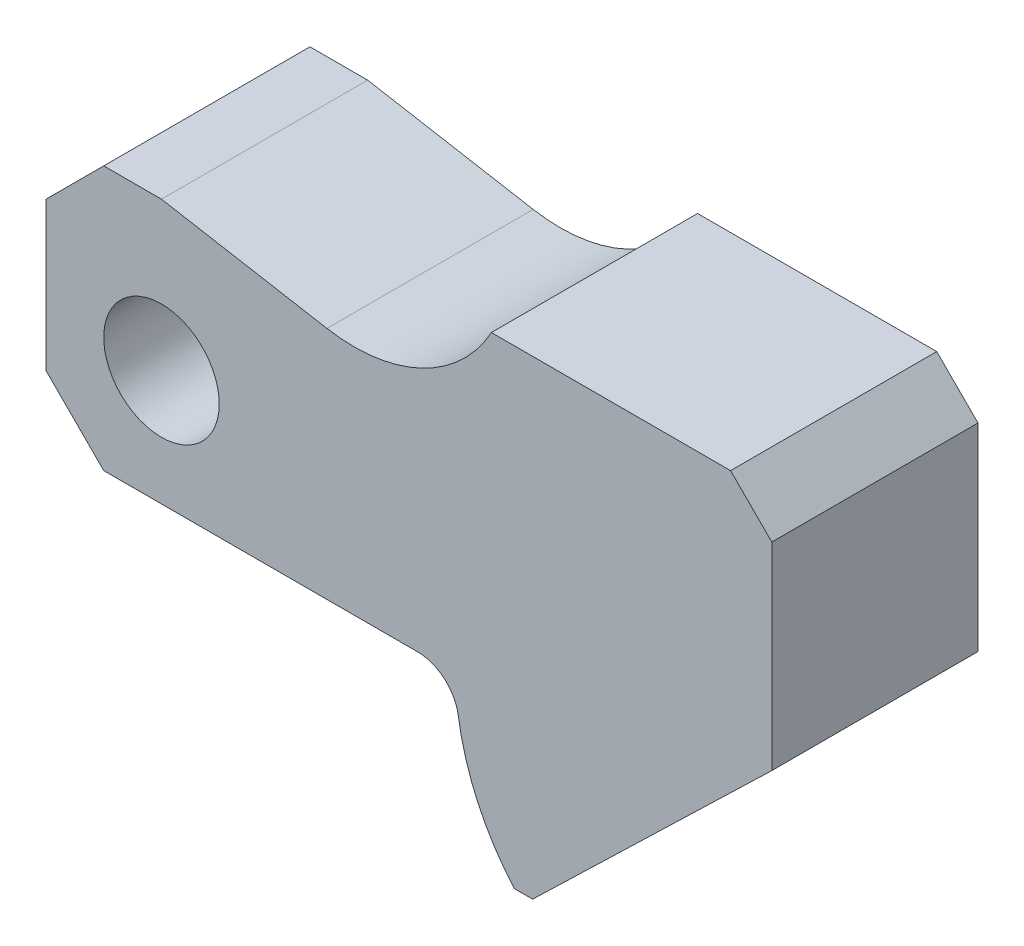
ISO-10303-21;
HEADER;
FILE_DESCRIPTION(('STEP AP214'),'2;1');
FILE_NAME('part.step','',(''),(''),'','','');
FILE_SCHEMA(('AUTOMOTIVE_DESIGN { 1 0 10303 214 1 1 1 1 }'));
ENDSEC;
DATA;
#1=APPLICATION_CONTEXT('core data for automotive mechanical design processes');
#2=APPLICATION_PROTOCOL_DEFINITION('international standard','automotive_design',2000,#1);
#3=PRODUCT_CONTEXT('',#1,'mechanical');
#4=PRODUCT('Part','Part','',(#3));
#5=PRODUCT_RELATED_PRODUCT_CATEGORY('part','',(#4));
#6=PRODUCT_DEFINITION_FORMATION('','',#4);
#7=PRODUCT_DEFINITION_CONTEXT('part definition',#1,'design');
#8=PRODUCT_DEFINITION('design','',#6,#7);
#9=PRODUCT_DEFINITION_SHAPE('','',#8);
#10=(LENGTH_UNIT() NAMED_UNIT(*) SI_UNIT(.MILLI.,.METRE.));
#11=(NAMED_UNIT(*) PLANE_ANGLE_UNIT() SI_UNIT($,.RADIAN.));
#12=(NAMED_UNIT(*) SI_UNIT($,.STERADIAN.) SOLID_ANGLE_UNIT());
#13=UNCERTAINTY_MEASURE_WITH_UNIT(LENGTH_MEASURE(1.E-05),#10,'distance_accuracy_value','');
#14=(GEOMETRIC_REPRESENTATION_CONTEXT(3) GLOBAL_UNCERTAINTY_ASSIGNED_CONTEXT((#13)) GLOBAL_UNIT_ASSIGNED_CONTEXT((#10,
#11,#12)) REPRESENTATION_CONTEXT('',''));
#15=CARTESIAN_POINT('',(0.,0.,0.));
#16=DIRECTION('',(0.,0.,1.));
#17=DIRECTION('',(1.,0.,0.));
#18=AXIS2_PLACEMENT_3D('',#15,#16,#17);
#19=CARTESIAN_POINT('',(0.,-10.,50.));
#20=DIRECTION('',(0.,0.,1.));
#21=DIRECTION('',(1.,0.,0.));
#22=AXIS2_PLACEMENT_3D('',#19,#20,#21);
#23=PLANE('',#22);
#24=CARTESIAN_POINT('',(0.,-10.,50.));
#25=DIRECTION('',(0.,0.,-1.));
#26=DIRECTION('',(1.,0.,0.));
#27=AXIS2_PLACEMENT_3D('',#24,#25,#26);
#28=CIRCLE('',#27,10.);
#29=CARTESIAN_POINT('',(0.,0.,50.));
#30=VERTEX_POINT('',#29);
#31=CARTESIAN_POINT('',(9.89127748282368,-8.52941176470592,50.));
#32=VERTEX_POINT('',#31);
#33=EDGE_CURVE('E221',#30,#32,#28,.T.);
#34=ORIENTED_EDGE('',*,*,#33,.T.);
#35=CARTESIAN_POINT('',(67.260686883201,0.,50.));
#36=DIRECTION('',(0.,0.,1.));
#37=DIRECTION('',(-1.,0.,0.));
#38=AXIS2_PLACEMENT_3D('',#35,#36,#37);
#39=CIRCLE('',#38,58.);
#40=CARTESIAN_POINT('',(23.4428822827877,-38.,50.));
#41=VERTEX_POINT('',#40);
#42=EDGE_CURVE('E120',#32,#41,#39,.T.);
#43=ORIENTED_EDGE('',*,*,#42,.T.);
#44=DIRECTION('',(1.,0.,0.));
#45=VECTOR('',#44,1.);
#46=CARTESIAN_POINT('',(27.9035440260581,-38.,50.));
#47=LINE('',#46,#45);
#48=CARTESIAN_POINT('',(27.9035440260581,-38.,50.));
#49=VERTEX_POINT('',#48);
#50=EDGE_CURVE('E267',#41,#49,#47,.T.);
#51=ORIENTED_EDGE('',*,*,#50,.T.);
#52=DIRECTION('',(0.719401460617409,0.694594513699567,0.));
#53=VECTOR('',#52,1.);
#54=CARTESIAN_POINT('',(85.9035440260581,18.,50.));
#55=LINE('',#54,#53);
#56=CARTESIAN_POINT('',(85.9035440260581,18.,50.));
#57=VERTEX_POINT('',#56);
#58=EDGE_CURVE('E287',#49,#57,#55,.T.);
#59=ORIENTED_EDGE('',*,*,#58,.T.);
#60=DIRECTION('',(0.,1.,0.));
#61=VECTOR('',#60,1.);
#62=CARTESIAN_POINT('',(85.9035440260581,66.,50.));
#63=LINE('',#62,#61);
#64=CARTESIAN_POINT('',(85.9035440260581,66.,50.));
#65=VERTEX_POINT('',#64);
#66=EDGE_CURVE('E283',#57,#65,#63,.T.);
#67=ORIENTED_EDGE('',*,*,#66,.T.);
#68=DIRECTION('',(-0.707106781186547,0.707106781186547,0.));
#69=VECTOR('',#68,1.);
#70=CARTESIAN_POINT('',(75.9035440260581,76.,50.));
#71=LINE('',#70,#69);
#72=CARTESIAN_POINT('',(75.9035440260581,76.,50.));
#73=VERTEX_POINT('',#72);
#74=EDGE_CURVE('E286',#65,#73,#71,.T.);
#75=ORIENTED_EDGE('',*,*,#74,.T.);
#76=DIRECTION('',(-1.,0.,0.));
#77=VECTOR('',#76,1.);
#78=CARTESIAN_POINT('',(17.9035440260581,76.,50.));
#79=LINE('',#78,#77);
#80=CARTESIAN_POINT('',(17.9035440260581,76.,50.));
#81=VERTEX_POINT('',#80);
#82=EDGE_CURVE('E292',#73,#81,#79,.T.);
#83=ORIENTED_EDGE('',*,*,#82,.T.);
#84=CARTESIAN_POINT('',(-15.3735066320414,94.3476946644064,50.));
#85=DIRECTION('',(0.,0.,-1.));
#86=DIRECTION('',(-1.,0.,0.));
#87=AXIS2_PLACEMENT_3D('',#84,#85,#86);
#88=CIRCLE('',#87,38.);
#89=CARTESIAN_POINT('',(-21.9721373833847,56.9250000499425,50.));
#90=VERTEX_POINT('',#89);
#91=EDGE_CURVE('E299',#81,#90,#88,.T.);
#92=ORIENTED_EDGE('',*,*,#91,.T.);
#93=DIRECTION('',(-0.984807753012208,0.173648177666931,0.));
#94=VECTOR('',#93,1.);
#95=CARTESIAN_POINT('',(-62.0964559739419,64.,50.));
#96=LINE('',#95,#94);
#97=CARTESIAN_POINT('',(-62.0964559739419,64.,50.));
#98=VERTEX_POINT('',#97);
#99=EDGE_CURVE('E302',#90,#98,#96,.T.);
#100=ORIENTED_EDGE('',*,*,#99,.T.);
#101=DIRECTION('',(-1.,0.,0.));
#102=VECTOR('',#101,1.);
#103=CARTESIAN_POINT('',(-76.0964559739419,64.,50.));
#104=LINE('',#103,#102);
#105=CARTESIAN_POINT('',(-76.0964559739419,64.,50.));
#106=VERTEX_POINT('',#105);
#107=EDGE_CURVE('E305',#98,#106,#104,.T.);
#108=ORIENTED_EDGE('',*,*,#107,.T.);
#109=DIRECTION('',(-0.707106781186549,-0.707106781186546,0.));
#110=VECTOR('',#109,1.);
#111=CARTESIAN_POINT('',(-90.0964559739419,50.,50.));
#112=LINE('',#111,#110);
#113=CARTESIAN_POINT('',(-90.0964559739419,50.,50.));
#114=VERTEX_POINT('',#113);
#115=EDGE_CURVE('E157',#106,#114,#112,.T.);
#116=ORIENTED_EDGE('',*,*,#115,.T.);
#117=DIRECTION('',(0.,-1.,0.));
#118=VECTOR('',#117,1.);
#119=CARTESIAN_POINT('',(-90.0964559739419,14.,50.));
#120=LINE('',#119,#118);
#121=CARTESIAN_POINT('',(-90.0964559739419,14.,50.));
#122=VERTEX_POINT('',#121);
#123=EDGE_CURVE('E151',#114,#122,#120,.T.);
#124=ORIENTED_EDGE('',*,*,#123,.T.);
#125=DIRECTION('',(0.707106781186549,-0.707106781186546,0.));
#126=VECTOR('',#125,1.);
#127=CARTESIAN_POINT('',(-76.0964559739419,0.,50.));
#128=LINE('',#127,#126);
#129=CARTESIAN_POINT('',(-76.0964559739419,0.,50.));
#130=VERTEX_POINT('',#129);
#131=EDGE_CURVE('E155',#122,#130,#128,.T.);
#132=ORIENTED_EDGE('',*,*,#131,.T.);
#133=DIRECTION('',(1.,0.,0.));
#134=VECTOR('',#133,1.);
#135=CARTESIAN_POINT('',(0.,0.,50.));
#136=LINE('',#135,#134);
#137=EDGE_CURVE('E59',#130,#30,#136,.T.);
#138=ORIENTED_EDGE('',*,*,#137,.T.);
#139=EDGE_LOOP('',(#34,#43,#51,#59,#67,#75,#83,#92,#100,#108,#116,#124,#132,#138));
#140=FACE_BOUND('',#139,.T.);
#141=CARTESIAN_POINT('',(-62.0964559739419,28.,50.));
#142=DIRECTION('',(0.,0.,1.));
#143=DIRECTION('',(1.,0.,0.));
#144=AXIS2_PLACEMENT_3D('',#141,#142,#143);
#145=CIRCLE('',#144,14.);
#146=CARTESIAN_POINT('',(-48.0964559739419,28.,50.));
#147=VERTEX_POINT('',#146);
#148=EDGE_CURVE('E185',#147,#147,#145,.T.);
#149=ORIENTED_EDGE('',*,*,#148,.F.);
#150=EDGE_LOOP('',(#149));
#151=FACE_BOUND('',#150,.T.);
#152=ADVANCED_FACE('F41',(#140,#151),#23,.T.);
#153=CARTESIAN_POINT('',(0.,-10.,0.));
#154=DIRECTION('',(0.,0.,1.));
#155=DIRECTION('',(1.,0.,0.));
#156=AXIS2_PLACEMENT_3D('',#153,#154,#155);
#157=PLANE('',#156);
#158=CARTESIAN_POINT('',(0.,-10.,0.));
#159=DIRECTION('',(0.,0.,-1.));
#160=DIRECTION('',(1.,0.,0.));
#161=AXIS2_PLACEMENT_3D('',#158,#159,#160);
#162=CIRCLE('',#161,10.);
#163=CARTESIAN_POINT('',(0.,0.,0.));
#164=VERTEX_POINT('',#163);
#165=CARTESIAN_POINT('',(9.89127748282368,-8.52941176470592,0.));
#166=VERTEX_POINT('',#165);
#167=EDGE_CURVE('E180',#164,#166,#162,.T.);
#168=ORIENTED_EDGE('',*,*,#167,.F.);
#169=DIRECTION('',(1.,0.,0.));
#170=VECTOR('',#169,1.);
#171=CARTESIAN_POINT('',(0.,0.,0.));
#172=LINE('',#171,#170);
#173=CARTESIAN_POINT('',(-76.0964559739419,0.,0.));
#174=VERTEX_POINT('',#173);
#175=EDGE_CURVE('E112',#174,#164,#172,.T.);
#176=ORIENTED_EDGE('',*,*,#175,.F.);
#177=DIRECTION('',(0.707106781186549,-0.707106781186546,0.));
#178=VECTOR('',#177,1.);
#179=CARTESIAN_POINT('',(-76.0964559739419,0.,0.));
#180=LINE('',#179,#178);
#181=CARTESIAN_POINT('',(-90.0964559739419,14.,0.));
#182=VERTEX_POINT('',#181);
#183=EDGE_CURVE('E106',#182,#174,#180,.T.);
#184=ORIENTED_EDGE('',*,*,#183,.F.);
#185=DIRECTION('',(0.,-1.,0.));
#186=VECTOR('',#185,1.);
#187=CARTESIAN_POINT('',(-90.0964559739419,14.,0.));
#188=LINE('',#187,#186);
#189=CARTESIAN_POINT('',(-90.0964559739419,50.,0.));
#190=VERTEX_POINT('',#189);
#191=EDGE_CURVE('E166',#190,#182,#188,.T.);
#192=ORIENTED_EDGE('',*,*,#191,.F.);
#193=DIRECTION('',(-0.707106781186549,-0.707106781186546,0.));
#194=VECTOR('',#193,1.);
#195=CARTESIAN_POINT('',(-90.0964559739419,50.,0.));
#196=LINE('',#195,#194);
#197=CARTESIAN_POINT('',(-76.0964559739419,64.,0.));
#198=VERTEX_POINT('',#197);
#199=EDGE_CURVE('E212',#198,#190,#196,.T.);
#200=ORIENTED_EDGE('',*,*,#199,.F.);
#201=DIRECTION('',(-1.,0.,0.));
#202=VECTOR('',#201,1.);
#203=CARTESIAN_POINT('',(-76.0964559739419,64.,0.));
#204=LINE('',#203,#202);
#205=CARTESIAN_POINT('',(-62.0964559739419,64.,0.));
#206=VERTEX_POINT('',#205);
#207=EDGE_CURVE('E209',#206,#198,#204,.T.);
#208=ORIENTED_EDGE('',*,*,#207,.F.);
#209=DIRECTION('',(-0.984807753012208,0.173648177666931,0.));
#210=VECTOR('',#209,1.);
#211=CARTESIAN_POINT('',(-62.0964559739419,64.,0.));
#212=LINE('',#211,#210);
#213=CARTESIAN_POINT('',(-21.9721373833847,56.9250000499425,0.));
#214=VERTEX_POINT('',#213);
#215=EDGE_CURVE('E206',#214,#206,#212,.T.);
#216=ORIENTED_EDGE('',*,*,#215,.F.);
#217=CARTESIAN_POINT('',(-15.3735066320414,94.3476946644064,0.));
#218=DIRECTION('',(0.,0.,-1.));
#219=DIRECTION('',(-1.,0.,0.));
#220=AXIS2_PLACEMENT_3D('',#217,#218,#219);
#221=CIRCLE('',#220,38.);
#222=CARTESIAN_POINT('',(17.9035440260581,76.,0.));
#223=VERTEX_POINT('',#222);
#224=EDGE_CURVE('E203',#223,#214,#221,.T.);
#225=ORIENTED_EDGE('',*,*,#224,.F.);
#226=DIRECTION('',(-1.,0.,0.));
#227=VECTOR('',#226,1.);
#228=CARTESIAN_POINT('',(17.9035440260581,76.,0.));
#229=LINE('',#228,#227);
#230=CARTESIAN_POINT('',(75.9035440260581,76.,0.));
#231=VERTEX_POINT('',#230);
#232=EDGE_CURVE('E200',#231,#223,#229,.T.);
#233=ORIENTED_EDGE('',*,*,#232,.F.);
#234=DIRECTION('',(-0.707106781186547,0.707106781186547,0.));
#235=VECTOR('',#234,1.);
#236=CARTESIAN_POINT('',(75.9035440260581,76.,0.));
#237=LINE('',#236,#235);
#238=CARTESIAN_POINT('',(85.9035440260581,66.,0.));
#239=VERTEX_POINT('',#238);
#240=EDGE_CURVE('E197',#239,#231,#237,.T.);
#241=ORIENTED_EDGE('',*,*,#240,.F.);
#242=DIRECTION('',(0.,1.,0.));
#243=VECTOR('',#242,1.);
#244=CARTESIAN_POINT('',(85.9035440260581,66.,0.));
#245=LINE('',#244,#243);
#246=CARTESIAN_POINT('',(85.9035440260581,18.,0.));
#247=VERTEX_POINT('',#246);
#248=EDGE_CURVE('E194',#247,#239,#245,.T.);
#249=ORIENTED_EDGE('',*,*,#248,.F.);
#250=DIRECTION('',(0.719401460617409,0.694594513699567,0.));
#251=VECTOR('',#250,1.);
#252=CARTESIAN_POINT('',(85.9035440260581,18.,0.));
#253=LINE('',#252,#251);
#254=CARTESIAN_POINT('',(27.9035440260581,-38.,0.));
#255=VERTEX_POINT('',#254);
#256=EDGE_CURVE('E191',#255,#247,#253,.T.);
#257=ORIENTED_EDGE('',*,*,#256,.F.);
#258=DIRECTION('',(1.,0.,0.));
#259=VECTOR('',#258,1.);
#260=CARTESIAN_POINT('',(27.9035440260581,-38.,0.));
#261=LINE('',#260,#259);
#262=CARTESIAN_POINT('',(23.4428822827877,-38.,0.));
#263=VERTEX_POINT('',#262);
#264=EDGE_CURVE('E188',#263,#255,#261,.T.);
#265=ORIENTED_EDGE('',*,*,#264,.F.);
#266=CARTESIAN_POINT('',(67.260686883201,0.,0.));
#267=DIRECTION('',(0.,0.,1.));
#268=DIRECTION('',(-1.,0.,0.));
#269=AXIS2_PLACEMENT_3D('',#266,#267,#268);
#270=CIRCLE('',#269,58.);
#271=EDGE_CURVE('E184',#166,#263,#270,.T.);
#272=ORIENTED_EDGE('',*,*,#271,.F.);
#273=EDGE_LOOP('',(#168,#176,#184,#192,#200,#208,#216,#225,#233,#241,#249,#257,#265,#272));
#274=FACE_BOUND('',#273,.T.);
#275=CARTESIAN_POINT('',(-62.0964559739419,28.,0.));
#276=DIRECTION('',(0.,0.,1.));
#277=DIRECTION('',(1.,0.,0.));
#278=AXIS2_PLACEMENT_3D('',#275,#276,#277);
#279=CIRCLE('',#278,14.);
#280=CARTESIAN_POINT('',(-48.0964559739419,28.,0.));
#281=VERTEX_POINT('',#280);
#282=EDGE_CURVE('E487',#281,#281,#279,.T.);
#283=ORIENTED_EDGE('',*,*,#282,.T.);
#284=EDGE_LOOP('',(#283));
#285=FACE_BOUND('',#284,.T.);
#286=ADVANCED_FACE('F271',(#274,#285),#157,.F.);
#287=CARTESIAN_POINT('',(0.,-10.,50.));
#288=DIRECTION('',(0.,0.,-1.));
#289=DIRECTION('',(-1.,0.,0.));
#290=AXIS2_PLACEMENT_3D('',#287,#288,#289);
#291=CYLINDRICAL_SURFACE('',#290,10.);
#292=ORIENTED_EDGE('',*,*,#167,.T.);
#293=DIRECTION('',(0.,0.,-1.));
#294=VECTOR('',#293,1.);
#295=CARTESIAN_POINT('',(9.89127748282368,-8.52941176470592,50.));
#296=LINE('',#295,#294);
#297=EDGE_CURVE('E11',#32,#166,#296,.T.);
#298=ORIENTED_EDGE('',*,*,#297,.F.);
#299=ORIENTED_EDGE('',*,*,#33,.F.);
#300=DIRECTION('',(0.,0.,-1.));
#301=VECTOR('',#300,1.);
#302=CARTESIAN_POINT('',(0.,0.,50.));
#303=LINE('',#302,#301);
#304=EDGE_CURVE('E176',#30,#164,#303,.T.);
#305=ORIENTED_EDGE('',*,*,#304,.T.);
#306=EDGE_LOOP('',(#292,#298,#299,#305));
#307=FACE_BOUND('',#306,.T.);
#308=ADVANCED_FACE('F43',(#307),#291,.F.);
#309=CARTESIAN_POINT('',(67.260686883201,0.,50.));
#310=DIRECTION('',(0.,0.,-1.));
#311=DIRECTION('',(-1.,0.,0.));
#312=AXIS2_PLACEMENT_3D('',#309,#310,#311);
#313=CYLINDRICAL_SURFACE('',#312,58.);
#314=ORIENTED_EDGE('',*,*,#271,.T.);
#315=DIRECTION('',(0.,0.,-1.));
#316=VECTOR('',#315,1.);
#317=CARTESIAN_POINT('',(23.4428822827877,-38.,50.));
#318=LINE('',#317,#316);
#319=EDGE_CURVE('E51',#41,#263,#318,.T.);
#320=ORIENTED_EDGE('',*,*,#319,.F.);
#321=ORIENTED_EDGE('',*,*,#42,.F.);
#322=ORIENTED_EDGE('',*,*,#297,.T.);
#323=EDGE_LOOP('',(#314,#320,#321,#322));
#324=FACE_BOUND('',#323,.T.);
#325=ADVANCED_FACE('F348',(#324),#313,.T.);
#326=CARTESIAN_POINT('',(27.9035440260581,-38.,50.));
#327=DIRECTION('',(0.,1.,0.));
#328=DIRECTION('',(0.,0.,1.));
#329=AXIS2_PLACEMENT_3D('',#326,#327,#328);
#330=PLANE('',#329);
#331=ORIENTED_EDGE('',*,*,#264,.T.);
#332=DIRECTION('',(0.,0.,-1.));
#333=VECTOR('',#332,1.);
#334=CARTESIAN_POINT('',(27.9035440260581,-38.,50.));
#335=LINE('',#334,#333);
#336=EDGE_CURVE('E256',#49,#255,#335,.T.);
#337=ORIENTED_EDGE('',*,*,#336,.F.);
#338=ORIENTED_EDGE('',*,*,#50,.F.);
#339=ORIENTED_EDGE('',*,*,#319,.T.);
#340=EDGE_LOOP('',(#331,#337,#338,#339));
#341=FACE_BOUND('',#340,.T.);
#342=ADVANCED_FACE('F265',(#341),#330,.F.);
#343=CARTESIAN_POINT('',(85.9035440260581,18.,50.));
#344=DIRECTION('',(-0.694594513699567,0.719401460617409,0.));
#345=DIRECTION('',(-0.719401460617409,-0.694594513699567,0.));
#346=AXIS2_PLACEMENT_3D('',#343,#344,#345);
#347=PLANE('',#346);
#348=ORIENTED_EDGE('',*,*,#256,.T.);
#349=DIRECTION('',(0.,0.,-1.));
#350=VECTOR('',#349,1.);
#351=CARTESIAN_POINT('',(85.9035440260581,18.,50.));
#352=LINE('',#351,#350);
#353=EDGE_CURVE('E252',#57,#247,#352,.T.);
#354=ORIENTED_EDGE('',*,*,#353,.F.);
#355=ORIENTED_EDGE('',*,*,#58,.F.);
#356=ORIENTED_EDGE('',*,*,#336,.T.);
#357=EDGE_LOOP('',(#348,#354,#355,#356));
#358=FACE_BOUND('',#357,.T.);
#359=ADVANCED_FACE('F277',(#358),#347,.F.);
#360=CARTESIAN_POINT('',(85.9035440260581,66.,50.));
#361=DIRECTION('',(-1.,0.,0.));
#362=DIRECTION('',(0.,-1.,0.));
#363=AXIS2_PLACEMENT_3D('',#360,#361,#362);
#364=PLANE('',#363);
#365=ORIENTED_EDGE('',*,*,#248,.T.);
#366=DIRECTION('',(0.,0.,-1.));
#367=VECTOR('',#366,1.);
#368=CARTESIAN_POINT('',(85.9035440260581,66.,50.));
#369=LINE('',#368,#367);
#370=EDGE_CURVE('E248',#65,#239,#369,.T.);
#371=ORIENTED_EDGE('',*,*,#370,.F.);
#372=ORIENTED_EDGE('',*,*,#66,.F.);
#373=ORIENTED_EDGE('',*,*,#353,.T.);
#374=EDGE_LOOP('',(#365,#371,#372,#373));
#375=FACE_BOUND('',#374,.T.);
#376=ADVANCED_FACE('F281',(#375),#364,.F.);
#377=CARTESIAN_POINT('',(75.9035440260581,76.,50.));
#378=DIRECTION('',(-0.707106781186547,-0.707106781186547,0.));
#379=DIRECTION('',(0.707106781186548,-0.707106781186548,0.));
#380=AXIS2_PLACEMENT_3D('',#377,#378,#379);
#381=PLANE('',#380);
#382=ORIENTED_EDGE('',*,*,#240,.T.);
#383=DIRECTION('',(0.,0.,-1.));
#384=VECTOR('',#383,1.);
#385=CARTESIAN_POINT('',(75.9035440260581,76.,50.));
#386=LINE('',#385,#384);
#387=EDGE_CURVE('E244',#73,#231,#386,.T.);
#388=ORIENTED_EDGE('',*,*,#387,.F.);
#389=ORIENTED_EDGE('',*,*,#74,.F.);
#390=ORIENTED_EDGE('',*,*,#370,.T.);
#391=EDGE_LOOP('',(#382,#388,#389,#390));
#392=FACE_BOUND('',#391,.T.);
#393=ADVANCED_FACE('F361',(#392),#381,.F.);
#394=CARTESIAN_POINT('',(17.9035440260581,76.,50.));
#395=DIRECTION('',(0.,-1.,0.));
#396=DIRECTION('',(0.,0.,-1.));
#397=AXIS2_PLACEMENT_3D('',#394,#395,#396);
#398=PLANE('',#397);
#399=ORIENTED_EDGE('',*,*,#232,.T.);
#400=DIRECTION('',(0.,0.,-1.));
#401=VECTOR('',#400,1.);
#402=CARTESIAN_POINT('',(17.9035440260581,76.,50.));
#403=LINE('',#402,#401);
#404=EDGE_CURVE('E240',#81,#223,#403,.T.);
#405=ORIENTED_EDGE('',*,*,#404,.F.);
#406=ORIENTED_EDGE('',*,*,#82,.F.);
#407=ORIENTED_EDGE('',*,*,#387,.T.);
#408=EDGE_LOOP('',(#399,#405,#406,#407));
#409=FACE_BOUND('',#408,.T.);
#410=ADVANCED_FACE('F364',(#409),#398,.F.);
#411=CARTESIAN_POINT('',(-15.3735066320414,94.3476946644064,50.));
#412=DIRECTION('',(0.,0.,-1.));
#413=DIRECTION('',(-1.,0.,0.));
#414=AXIS2_PLACEMENT_3D('',#411,#412,#413);
#415=CYLINDRICAL_SURFACE('',#414,38.);
#416=ORIENTED_EDGE('',*,*,#224,.T.);
#417=DIRECTION('',(0.,0.,-1.));
#418=VECTOR('',#417,1.);
#419=CARTESIAN_POINT('',(-21.9721373833847,56.9250000499425,50.));
#420=LINE('',#419,#418);
#421=EDGE_CURVE('E236',#90,#214,#420,.T.);
#422=ORIENTED_EDGE('',*,*,#421,.F.);
#423=ORIENTED_EDGE('',*,*,#91,.F.);
#424=ORIENTED_EDGE('',*,*,#404,.T.);
#425=EDGE_LOOP('',(#416,#422,#423,#424));
#426=FACE_BOUND('',#425,.T.);
#427=ADVANCED_FACE('F368',(#426),#415,.F.);
#428=CARTESIAN_POINT('',(-62.0964559739419,64.,50.));
#429=DIRECTION('',(-0.173648177666931,-0.984807753012208,0.));
#430=DIRECTION('',(0.984807753012208,-0.173648177666931,0.));
#431=AXIS2_PLACEMENT_3D('',#428,#429,#430);
#432=PLANE('',#431);
#433=ORIENTED_EDGE('',*,*,#215,.T.);
#434=DIRECTION('',(0.,0.,-1.));
#435=VECTOR('',#434,1.);
#436=CARTESIAN_POINT('',(-62.0964559739419,64.,50.));
#437=LINE('',#436,#435);
#438=EDGE_CURVE('E232',#98,#206,#437,.T.);
#439=ORIENTED_EDGE('',*,*,#438,.F.);
#440=ORIENTED_EDGE('',*,*,#99,.F.);
#441=ORIENTED_EDGE('',*,*,#421,.T.);
#442=EDGE_LOOP('',(#433,#439,#440,#441));
#443=FACE_BOUND('',#442,.T.);
#444=ADVANCED_FACE('F372',(#443),#432,.F.);
#445=CARTESIAN_POINT('',(-76.0964559739419,64.,50.));
#446=DIRECTION('',(0.,-1.,0.));
#447=DIRECTION('',(1.,0.,0.));
#448=AXIS2_PLACEMENT_3D('',#445,#446,#447);
#449=PLANE('',#448);
#450=ORIENTED_EDGE('',*,*,#207,.T.);
#451=DIRECTION('',(0.,0.,-1.));
#452=VECTOR('',#451,1.);
#453=CARTESIAN_POINT('',(-76.0964559739419,64.,50.));
#454=LINE('',#453,#452);
#455=EDGE_CURVE('E228',#106,#198,#454,.T.);
#456=ORIENTED_EDGE('',*,*,#455,.F.);
#457=ORIENTED_EDGE('',*,*,#107,.F.);
#458=ORIENTED_EDGE('',*,*,#438,.T.);
#459=EDGE_LOOP('',(#450,#456,#457,#458));
#460=FACE_BOUND('',#459,.T.);
#461=ADVANCED_FACE('F320',(#460),#449,.F.);
#462=CARTESIAN_POINT('',(-90.0964559739419,50.,50.));
#463=DIRECTION('',(0.707106781186546,-0.707106781186549,0.));
#464=DIRECTION('',(0.707106781186549,0.707106781186546,0.));
#465=AXIS2_PLACEMENT_3D('',#462,#463,#464);
#466=PLANE('',#465);
#467=ORIENTED_EDGE('',*,*,#199,.T.);
#468=DIRECTION('',(0.,0.,-1.));
#469=VECTOR('',#468,1.);
#470=CARTESIAN_POINT('',(-90.0964559739419,50.,50.));
#471=LINE('',#470,#469);
#472=EDGE_CURVE('E168',#114,#190,#471,.T.);
#473=ORIENTED_EDGE('',*,*,#472,.F.);
#474=ORIENTED_EDGE('',*,*,#115,.F.);
#475=ORIENTED_EDGE('',*,*,#455,.T.);
#476=EDGE_LOOP('',(#467,#473,#474,#475));
#477=FACE_BOUND('',#476,.T.);
#478=ADVANCED_FACE('F324',(#477),#466,.F.);
#479=CARTESIAN_POINT('',(-90.0964559739419,14.,50.));
#480=DIRECTION('',(1.,0.,0.));
#481=DIRECTION('',(0.,0.,-1.));
#482=AXIS2_PLACEMENT_3D('',#479,#480,#481);
#483=PLANE('',#482);
#484=ORIENTED_EDGE('',*,*,#191,.T.);
#485=DIRECTION('',(0.,0.,-1.));
#486=VECTOR('',#485,1.);
#487=CARTESIAN_POINT('',(-90.0964559739419,14.,50.));
#488=LINE('',#487,#486);
#489=EDGE_CURVE('E163',#122,#182,#488,.T.);
#490=ORIENTED_EDGE('',*,*,#489,.F.);
#491=ORIENTED_EDGE('',*,*,#123,.F.);
#492=ORIENTED_EDGE('',*,*,#472,.T.);
#493=EDGE_LOOP('',(#484,#490,#491,#492));
#494=FACE_BOUND('',#493,.T.);
#495=ADVANCED_FACE('F164',(#494),#483,.F.);
#496=CARTESIAN_POINT('',(-76.0964559739419,0.,50.));
#497=DIRECTION('',(0.707106781186546,0.707106781186549,0.));
#498=DIRECTION('',(-0.707106781186549,0.707106781186546,0.));
#499=AXIS2_PLACEMENT_3D('',#496,#497,#498);
#500=PLANE('',#499);
#501=ORIENTED_EDGE('',*,*,#183,.T.);
#502=DIRECTION('',(0.,0.,-1.));
#503=VECTOR('',#502,1.);
#504=CARTESIAN_POINT('',(-76.0964559739419,0.,50.));
#505=LINE('',#504,#503);
#506=EDGE_CURVE('E169',#130,#174,#505,.T.);
#507=ORIENTED_EDGE('',*,*,#506,.F.);
#508=ORIENTED_EDGE('',*,*,#131,.F.);
#509=ORIENTED_EDGE('',*,*,#489,.T.);
#510=EDGE_LOOP('',(#501,#507,#508,#509));
#511=FACE_BOUND('',#510,.T.);
#512=ADVANCED_FACE('F171',(#511),#500,.F.);
#513=CARTESIAN_POINT('',(0.,0.,50.));
#514=DIRECTION('',(0.,1.,0.));
#515=DIRECTION('',(-1.,0.,0.));
#516=AXIS2_PLACEMENT_3D('',#513,#514,#515);
#517=PLANE('',#516);
#518=ORIENTED_EDGE('',*,*,#175,.T.);
#519=ORIENTED_EDGE('',*,*,#304,.F.);
#520=ORIENTED_EDGE('',*,*,#137,.F.);
#521=ORIENTED_EDGE('',*,*,#506,.T.);
#522=EDGE_LOOP('',(#518,#519,#520,#521));
#523=FACE_BOUND('',#522,.T.);
#524=ADVANCED_FACE('F328',(#523),#517,.F.);
#525=CARTESIAN_POINT('',(-62.0964559739419,28.,50.));
#526=DIRECTION('',(0.,0.,-1.));
#527=DIRECTION('',(-1.,0.,0.));
#528=AXIS2_PLACEMENT_3D('',#525,#526,#527);
#529=CYLINDRICAL_SURFACE('',#528,14.);
#530=ORIENTED_EDGE('',*,*,#148,.T.);
#531=EDGE_LOOP('',(#530));
#532=FACE_BOUND('',#531,.T.);
#533=ORIENTED_EDGE('',*,*,#282,.F.);
#534=EDGE_LOOP('',(#533));
#535=FACE_BOUND('',#534,.T.);
#536=ADVANCED_FACE('F330',(#532,#535),#529,.F.);
#537=CLOSED_SHELL('',(#152,#286,#308,#325,#342,#359,#376,#393,#410,#427,#444,#461,#478,#495,
#512,#524,#536));
#538=MANIFOLD_SOLID_BREP('B2',#537);
#539=ADVANCED_BREP_SHAPE_REPRESENTATION('',(#18,#538),#14);
#540=SHAPE_DEFINITION_REPRESENTATION(#9,#539);
ENDSEC;
END-ISO-10303-21;
